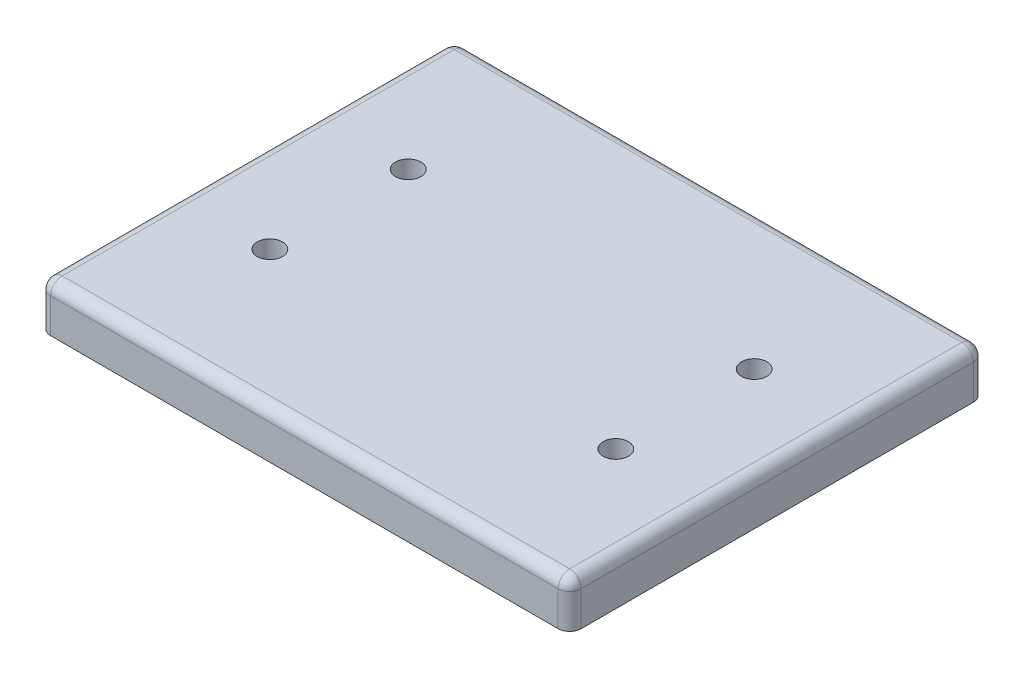
ISO-10303-21;
HEADER;
FILE_DESCRIPTION(('STEP AP214'),'2;1');
FILE_NAME('part.step','',(''),(''),'','','');
FILE_SCHEMA(('AUTOMOTIVE_DESIGN { 1 0 10303 214 1 1 1 1 }'));
ENDSEC;
DATA;
#1=APPLICATION_CONTEXT('core data for automotive mechanical design processes');
#2=APPLICATION_PROTOCOL_DEFINITION('international standard','automotive_design',2000,#1);
#3=PRODUCT_CONTEXT('',#1,'mechanical');
#4=PRODUCT('Part','Part','',(#3));
#5=PRODUCT_RELATED_PRODUCT_CATEGORY('part','',(#4));
#6=PRODUCT_DEFINITION_FORMATION('','',#4);
#7=PRODUCT_DEFINITION_CONTEXT('part definition',#1,'design');
#8=PRODUCT_DEFINITION('design','',#6,#7);
#9=PRODUCT_DEFINITION_SHAPE('','',#8);
#10=(LENGTH_UNIT() NAMED_UNIT(*) SI_UNIT(.MILLI.,.METRE.));
#11=(NAMED_UNIT(*) PLANE_ANGLE_UNIT() SI_UNIT($,.RADIAN.));
#12=(NAMED_UNIT(*) SI_UNIT($,.STERADIAN.) SOLID_ANGLE_UNIT());
#13=UNCERTAINTY_MEASURE_WITH_UNIT(LENGTH_MEASURE(1.E-05),#10,'distance_accuracy_value','');
#14=(GEOMETRIC_REPRESENTATION_CONTEXT(3) GLOBAL_UNCERTAINTY_ASSIGNED_CONTEXT((#13)) GLOBAL_UNIT_ASSIGNED_CONTEXT((#10,
#11,#12)) REPRESENTATION_CONTEXT('',''));
#15=CARTESIAN_POINT('',(0.,0.,0.));
#16=DIRECTION('',(0.,0.,1.));
#17=DIRECTION('',(1.,0.,0.));
#18=AXIS2_PLACEMENT_3D('',#15,#16,#17);
#19=CARTESIAN_POINT('',(115.,20.,-90.));
#20=DIRECTION('',(-1.,0.,0.));
#21=DIRECTION('',(0.,0.,1.));
#22=AXIS2_PLACEMENT_3D('',#19,#20,#21);
#23=PLANE('',#22);
#24=DIRECTION('',(0.,0.,-1.));
#25=VECTOR('',#24,1.);
#26=CARTESIAN_POINT('',(115.,0.,-90.));
#27=LINE('',#26,#25);
#28=CARTESIAN_POINT('',(115.,0.,84.9999999999999));
#29=VERTEX_POINT('',#28);
#30=CARTESIAN_POINT('',(115.,0.,-85.));
#31=VERTEX_POINT('',#30);
#32=EDGE_CURVE('E238',#29,#31,#27,.T.);
#33=ORIENTED_EDGE('',*,*,#32,.T.);
#34=DIRECTION('',(0.,-1.,0.));
#35=VECTOR('',#34,1.);
#36=CARTESIAN_POINT('',(115.,20.,-85.));
#37=LINE('',#36,#35);
#38=CARTESIAN_POINT('',(115.,15.,-85.));
#39=VERTEX_POINT('',#38);
#40=EDGE_CURVE('E209',#31,#39,#37,.F.);
#41=ORIENTED_EDGE('',*,*,#40,.T.);
#42=DIRECTION('',(0.,0.,-1.));
#43=VECTOR('',#42,1.);
#44=CARTESIAN_POINT('',(115.,15.,90.));
#45=LINE('',#44,#43);
#46=CARTESIAN_POINT('',(115.,15.,85.));
#47=VERTEX_POINT('',#46);
#48=EDGE_CURVE('E125',#39,#47,#45,.F.);
#49=ORIENTED_EDGE('',*,*,#48,.T.);
#50=DIRECTION('',(0.,-1.,0.));
#51=VECTOR('',#50,1.);
#52=CARTESIAN_POINT('',(115.,20.,85.));
#53=LINE('',#52,#51);
#54=EDGE_CURVE('E207',#47,#29,#53,.T.);
#55=ORIENTED_EDGE('',*,*,#54,.T.);
#56=EDGE_LOOP('',(#33,#41,#49,#55));
#57=FACE_BOUND('',#56,.T.);
#58=ADVANCED_FACE('F35',(#57),#23,.F.);
#59=CARTESIAN_POINT('',(-115.,20.,-90.));
#60=DIRECTION('',(0.,0.,1.));
#61=DIRECTION('',(1.,0.,0.));
#62=AXIS2_PLACEMENT_3D('',#59,#60,#61);
#63=PLANE('',#62);
#64=DIRECTION('',(-1.,0.,0.));
#65=VECTOR('',#64,1.);
#66=CARTESIAN_POINT('',(115.,15.,-90.));
#67=LINE('',#66,#65);
#68=CARTESIAN_POINT('',(-110.,15.,-90.));
#69=VERTEX_POINT('',#68);
#70=CARTESIAN_POINT('',(110.,15.,-90.));
#71=VERTEX_POINT('',#70);
#72=EDGE_CURVE('E162',#69,#71,#67,.F.);
#73=ORIENTED_EDGE('',*,*,#72,.T.);
#74=DIRECTION('',(0.,-1.,0.));
#75=VECTOR('',#74,1.);
#76=CARTESIAN_POINT('',(110.,20.,-90.));
#77=LINE('',#76,#75);
#78=CARTESIAN_POINT('',(110.,0.,-90.));
#79=VERTEX_POINT('',#78);
#80=EDGE_CURVE('E198',#71,#79,#77,.T.);
#81=ORIENTED_EDGE('',*,*,#80,.T.);
#82=DIRECTION('',(-1.,0.,0.));
#83=VECTOR('',#82,1.);
#84=CARTESIAN_POINT('',(-115.,0.,-90.));
#85=LINE('',#84,#83);
#86=CARTESIAN_POINT('',(-110.,0.,-90.));
#87=VERTEX_POINT('',#86);
#88=EDGE_CURVE('E243',#79,#87,#85,.T.);
#89=ORIENTED_EDGE('',*,*,#88,.T.);
#90=DIRECTION('',(0.,-1.,0.));
#91=VECTOR('',#90,1.);
#92=CARTESIAN_POINT('',(-110.,20.,-90.));
#93=LINE('',#92,#91);
#94=EDGE_CURVE('E196',#87,#69,#93,.F.);
#95=ORIENTED_EDGE('',*,*,#94,.T.);
#96=EDGE_LOOP('',(#73,#81,#89,#95));
#97=FACE_BOUND('',#96,.T.);
#98=ADVANCED_FACE('F268',(#97),#63,.F.);
#99=CARTESIAN_POINT('',(-115.,20.,-90.));
#100=DIRECTION('',(1.,0.,0.));
#101=DIRECTION('',(0.,0.,-1.));
#102=AXIS2_PLACEMENT_3D('',#99,#100,#101);
#103=PLANE('',#102);
#104=DIRECTION('',(0.,0.,1.));
#105=VECTOR('',#104,1.);
#106=CARTESIAN_POINT('',(-115.,15.,-90.));
#107=LINE('',#106,#105);
#108=CARTESIAN_POINT('',(-115.,15.,85.));
#109=VERTEX_POINT('',#108);
#110=CARTESIAN_POINT('',(-115.,15.,-85.));
#111=VERTEX_POINT('',#110);
#112=EDGE_CURVE('E156',#109,#111,#107,.F.);
#113=ORIENTED_EDGE('',*,*,#112,.T.);
#114=DIRECTION('',(0.,-1.,0.));
#115=VECTOR('',#114,1.);
#116=CARTESIAN_POINT('',(-115.,20.,-85.));
#117=LINE('',#116,#115);
#118=CARTESIAN_POINT('',(-115.,0.,-85.));
#119=VERTEX_POINT('',#118);
#120=EDGE_CURVE('E59',#111,#119,#117,.T.);
#121=ORIENTED_EDGE('',*,*,#120,.T.);
#122=DIRECTION('',(0.,0.,1.));
#123=VECTOR('',#122,1.);
#124=CARTESIAN_POINT('',(-115.,0.,-90.));
#125=LINE('',#124,#123);
#126=CARTESIAN_POINT('',(-115.,0.,84.9999999999999));
#127=VERTEX_POINT('',#126);
#128=EDGE_CURVE('E247',#119,#127,#125,.T.);
#129=ORIENTED_EDGE('',*,*,#128,.T.);
#130=DIRECTION('',(0.,-1.,0.));
#131=VECTOR('',#130,1.);
#132=CARTESIAN_POINT('',(-115.,20.,85.));
#133=LINE('',#132,#131);
#134=EDGE_CURVE('E211',#127,#109,#133,.F.);
#135=ORIENTED_EDGE('',*,*,#134,.T.);
#136=EDGE_LOOP('',(#113,#121,#129,#135));
#137=FACE_BOUND('',#136,.T.);
#138=ADVANCED_FACE('F292',(#137),#103,.F.);
#139=CARTESIAN_POINT('',(-115.,20.,90.));
#140=DIRECTION('',(0.,0.,-1.));
#141=DIRECTION('',(-1.,0.,0.));
#142=AXIS2_PLACEMENT_3D('',#139,#140,#141);
#143=PLANE('',#142);
#144=DIRECTION('',(1.,0.,0.));
#145=VECTOR('',#144,1.);
#146=CARTESIAN_POINT('',(-115.,15.,90.));
#147=LINE('',#146,#145);
#148=CARTESIAN_POINT('',(110.,15.,90.));
#149=VERTEX_POINT('',#148);
#150=CARTESIAN_POINT('',(-110.,15.,90.));
#151=VERTEX_POINT('',#150);
#152=EDGE_CURVE('E136',#149,#151,#147,.F.);
#153=ORIENTED_EDGE('',*,*,#152,.T.);
#154=DIRECTION('',(0.,-1.,0.));
#155=VECTOR('',#154,1.);
#156=CARTESIAN_POINT('',(-110.,20.,90.));
#157=LINE('',#156,#155);
#158=CARTESIAN_POINT('',(-110.,0.,90.));
#159=VERTEX_POINT('',#158);
#160=EDGE_CURVE('E11',#151,#159,#157,.T.);
#161=ORIENTED_EDGE('',*,*,#160,.T.);
#162=DIRECTION('',(1.,0.,0.));
#163=VECTOR('',#162,1.);
#164=CARTESIAN_POINT('',(-115.,0.,90.));
#165=LINE('',#164,#163);
#166=CARTESIAN_POINT('',(110.,0.,90.));
#167=VERTEX_POINT('',#166);
#168=EDGE_CURVE('E149',#159,#167,#165,.T.);
#169=ORIENTED_EDGE('',*,*,#168,.T.);
#170=DIRECTION('',(0.,-1.,0.));
#171=VECTOR('',#170,1.);
#172=CARTESIAN_POINT('',(110.,20.,90.));
#173=LINE('',#172,#171);
#174=EDGE_CURVE('E44',#167,#149,#173,.F.);
#175=ORIENTED_EDGE('',*,*,#174,.T.);
#176=EDGE_LOOP('',(#153,#161,#169,#175));
#177=FACE_BOUND('',#176,.T.);
#178=ADVANCED_FACE('F230',(#177),#143,.F.);
#179=CARTESIAN_POINT('',(0.,20.,0.));
#180=DIRECTION('',(0.,1.,0.));
#181=DIRECTION('',(0.,0.,1.));
#182=AXIS2_PLACEMENT_3D('',#179,#180,#181);
#183=PLANE('',#182);
#184=CARTESIAN_POINT('',(-75.,20.,-30.));
#185=DIRECTION('',(0.,1.,0.));
#186=DIRECTION('',(0.,0.,1.));
#187=AXIS2_PLACEMENT_3D('',#184,#185,#186);
#188=CIRCLE('',#187,5.5);
#189=CARTESIAN_POINT('',(-75.,20.,-24.5));
#190=VERTEX_POINT('',#189);
#191=EDGE_CURVE('E184',#190,#190,#188,.T.);
#192=ORIENTED_EDGE('',*,*,#191,.F.);
#193=EDGE_LOOP('',(#192));
#194=FACE_BOUND('',#193,.T.);
#195=CARTESIAN_POINT('',(75.,20.,-30.));
#196=DIRECTION('',(0.,-1.,0.));
#197=DIRECTION('',(0.,0.,1.));
#198=AXIS2_PLACEMENT_3D('',#195,#196,#197);
#199=CIRCLE('',#198,5.5);
#200=CARTESIAN_POINT('',(75.,20.,-24.5));
#201=VERTEX_POINT('',#200);
#202=EDGE_CURVE('E180',#201,#201,#199,.T.);
#203=ORIENTED_EDGE('',*,*,#202,.T.);
#204=EDGE_LOOP('',(#203));
#205=FACE_BOUND('',#204,.T.);
#206=CARTESIAN_POINT('',(75.,20.,30.));
#207=DIRECTION('',(0.,1.,0.));
#208=DIRECTION('',(0.,0.,-1.));
#209=AXIS2_PLACEMENT_3D('',#206,#207,#208);
#210=CIRCLE('',#209,5.5);
#211=CARTESIAN_POINT('',(75.,20.,24.5));
#212=VERTEX_POINT('',#211);
#213=EDGE_CURVE('E175',#212,#212,#210,.T.);
#214=ORIENTED_EDGE('',*,*,#213,.F.);
#215=EDGE_LOOP('',(#214));
#216=FACE_BOUND('',#215,.T.);
#217=CARTESIAN_POINT('',(-75.,20.,30.));
#218=DIRECTION('',(0.,-1.,0.));
#219=DIRECTION('',(0.,0.,-1.));
#220=AXIS2_PLACEMENT_3D('',#217,#218,#219);
#221=CIRCLE('',#220,5.5);
#222=CARTESIAN_POINT('',(-75.,20.,24.5));
#223=VERTEX_POINT('',#222);
#224=EDGE_CURVE('E170',#223,#223,#221,.T.);
#225=ORIENTED_EDGE('',*,*,#224,.T.);
#226=EDGE_LOOP('',(#225));
#227=FACE_BOUND('',#226,.T.);
#228=DIRECTION('',(0.,0.,1.));
#229=VECTOR('',#228,1.);
#230=CARTESIAN_POINT('',(-110.,20.,90.));
#231=LINE('',#230,#229);
#232=CARTESIAN_POINT('',(-110.,20.,-85.));
#233=VERTEX_POINT('',#232);
#234=CARTESIAN_POINT('',(-110.,20.,85.));
#235=VERTEX_POINT('',#234);
#236=EDGE_CURVE('E154',#233,#235,#231,.T.);
#237=ORIENTED_EDGE('',*,*,#236,.T.);
#238=DIRECTION('',(1.,0.,0.));
#239=VECTOR('',#238,1.);
#240=CARTESIAN_POINT('',(115.,20.,85.));
#241=LINE('',#240,#239);
#242=CARTESIAN_POINT('',(110.,20.,85.));
#243=VERTEX_POINT('',#242);
#244=EDGE_CURVE('E133',#235,#243,#241,.T.);
#245=ORIENTED_EDGE('',*,*,#244,.T.);
#246=DIRECTION('',(0.,0.,-1.));
#247=VECTOR('',#246,1.);
#248=CARTESIAN_POINT('',(110.,20.,-90.));
#249=LINE('',#248,#247);
#250=CARTESIAN_POINT('',(110.,20.,-85.));
#251=VERTEX_POINT('',#250);
#252=EDGE_CURVE('E142',#243,#251,#249,.T.);
#253=ORIENTED_EDGE('',*,*,#252,.T.);
#254=DIRECTION('',(-1.,0.,0.));
#255=VECTOR('',#254,1.);
#256=CARTESIAN_POINT('',(-115.,20.,-85.));
#257=LINE('',#256,#255);
#258=EDGE_CURVE('E148',#251,#233,#257,.T.);
#259=ORIENTED_EDGE('',*,*,#258,.T.);
#260=EDGE_LOOP('',(#237,#245,#253,#259));
#261=FACE_BOUND('',#260,.T.);
#262=ADVANCED_FACE('F152',(#194,#205,#216,#227,#261),#183,.T.);
#263=CARTESIAN_POINT('',(0.,0.,0.));
#264=DIRECTION('',(0.,1.,0.));
#265=DIRECTION('',(0.,0.,1.));
#266=AXIS2_PLACEMENT_3D('',#263,#264,#265);
#267=PLANE('',#266);
#268=CARTESIAN_POINT('',(-75.,0.,-30.));
#269=DIRECTION('',(0.,1.,0.));
#270=DIRECTION('',(0.,0.,1.));
#271=AXIS2_PLACEMENT_3D('',#268,#269,#270);
#272=CIRCLE('',#271,9.00000000000001);
#273=CARTESIAN_POINT('',(-75.,0.,-21.));
#274=VERTEX_POINT('',#273);
#275=EDGE_CURVE('E183',#274,#274,#272,.T.);
#276=ORIENTED_EDGE('',*,*,#275,.T.);
#277=EDGE_LOOP('',(#276));
#278=FACE_BOUND('',#277,.T.);
#279=CARTESIAN_POINT('',(75.,0.,-30.));
#280=DIRECTION('',(0.,-1.,0.));
#281=DIRECTION('',(0.,0.,1.));
#282=AXIS2_PLACEMENT_3D('',#279,#280,#281);
#283=CIRCLE('',#282,9.00000000000001);
#284=CARTESIAN_POINT('',(75.,0.,-21.));
#285=VERTEX_POINT('',#284);
#286=EDGE_CURVE('E179',#285,#285,#283,.T.);
#287=ORIENTED_EDGE('',*,*,#286,.F.);
#288=EDGE_LOOP('',(#287));
#289=FACE_BOUND('',#288,.T.);
#290=CARTESIAN_POINT('',(75.,0.,30.));
#291=DIRECTION('',(0.,1.,0.));
#292=DIRECTION('',(0.,0.,-1.));
#293=AXIS2_PLACEMENT_3D('',#290,#291,#292);
#294=CIRCLE('',#293,9.00000000000001);
#295=CARTESIAN_POINT('',(75.,0.,21.));
#296=VERTEX_POINT('',#295);
#297=EDGE_CURVE('E174',#296,#296,#294,.T.);
#298=ORIENTED_EDGE('',*,*,#297,.T.);
#299=EDGE_LOOP('',(#298));
#300=FACE_BOUND('',#299,.T.);
#301=CARTESIAN_POINT('',(-75.,0.,30.));
#302=DIRECTION('',(0.,-1.,0.));
#303=DIRECTION('',(0.,0.,-1.));
#304=AXIS2_PLACEMENT_3D('',#301,#302,#303);
#305=CIRCLE('',#304,9.00000000000001);
#306=CARTESIAN_POINT('',(-75.,0.,21.));
#307=VERTEX_POINT('',#306);
#308=EDGE_CURVE('E169',#307,#307,#305,.T.);
#309=ORIENTED_EDGE('',*,*,#308,.F.);
#310=EDGE_LOOP('',(#309));
#311=FACE_BOUND('',#310,.T.);
#312=ORIENTED_EDGE('',*,*,#88,.F.);
#313=CARTESIAN_POINT('',(110.,0.,-85.));
#314=DIRECTION('',(0.,1.,0.));
#315=DIRECTION('',(0.,0.,1.));
#316=AXIS2_PLACEMENT_3D('',#313,#314,#315);
#317=CIRCLE('',#316,5.);
#318=EDGE_CURVE('E205',#79,#31,#317,.F.);
#319=ORIENTED_EDGE('',*,*,#318,.T.);
#320=ORIENTED_EDGE('',*,*,#32,.F.);
#321=CARTESIAN_POINT('',(110.,0.,85.));
#322=DIRECTION('',(0.,1.,0.));
#323=DIRECTION('',(0.,0.,1.));
#324=AXIS2_PLACEMENT_3D('',#321,#322,#323);
#325=CIRCLE('',#324,5.);
#326=EDGE_CURVE('E200',#29,#167,#325,.F.);
#327=ORIENTED_EDGE('',*,*,#326,.T.);
#328=ORIENTED_EDGE('',*,*,#168,.F.);
#329=CARTESIAN_POINT('',(-110.,0.,85.));
#330=DIRECTION('',(0.,1.,0.));
#331=DIRECTION('',(0.,0.,1.));
#332=AXIS2_PLACEMENT_3D('',#329,#330,#331);
#333=CIRCLE('',#332,5.);
#334=EDGE_CURVE('E52',#159,#127,#333,.F.);
#335=ORIENTED_EDGE('',*,*,#334,.T.);
#336=ORIENTED_EDGE('',*,*,#128,.F.);
#337=CARTESIAN_POINT('',(-110.,0.,-85.));
#338=DIRECTION('',(0.,1.,0.));
#339=DIRECTION('',(0.,0.,1.));
#340=AXIS2_PLACEMENT_3D('',#337,#338,#339);
#341=CIRCLE('',#340,5.);
#342=EDGE_CURVE('E203',#119,#87,#341,.F.);
#343=ORIENTED_EDGE('',*,*,#342,.T.);
#344=EDGE_LOOP('',(#312,#319,#320,#327,#328,#335,#336,#343));
#345=FACE_BOUND('',#344,.T.);
#346=ADVANCED_FACE('F241',(#278,#289,#300,#311,#345),#267,.F.);
#347=CARTESIAN_POINT('',(0.,15.,-85.));
#348=DIRECTION('',(1.,0.,0.));
#349=DIRECTION('',(0.,0.,-1.));
#350=AXIS2_PLACEMENT_3D('',#347,#348,#349);
#351=CYLINDRICAL_SURFACE('',#350,5.);
#352=ORIENTED_EDGE('',*,*,#258,.F.);
#353=CARTESIAN_POINT('',(110.,15.,-85.));
#354=DIRECTION('',(1.,0.,0.));
#355=DIRECTION('',(0.,0.,-1.));
#356=AXIS2_PLACEMENT_3D('',#353,#354,#355);
#357=CIRCLE('',#356,5.);
#358=EDGE_CURVE('E189',#251,#71,#357,.F.);
#359=ORIENTED_EDGE('',*,*,#358,.T.);
#360=ORIENTED_EDGE('',*,*,#72,.F.);
#361=CARTESIAN_POINT('',(-110.,15.,-85.));
#362=DIRECTION('',(1.,0.,0.));
#363=DIRECTION('',(0.,0.,-1.));
#364=AXIS2_PLACEMENT_3D('',#361,#362,#363);
#365=CIRCLE('',#364,5.);
#366=EDGE_CURVE('E187',#69,#233,#365,.T.);
#367=ORIENTED_EDGE('',*,*,#366,.T.);
#368=EDGE_LOOP('',(#352,#359,#360,#367));
#369=FACE_BOUND('',#368,.T.);
#370=ADVANCED_FACE('F276',(#369),#351,.T.);
#371=CARTESIAN_POINT('',(-110.,15.,0.));
#372=DIRECTION('',(0.,0.,-1.));
#373=DIRECTION('',(-1.,0.,0.));
#374=AXIS2_PLACEMENT_3D('',#371,#372,#373);
#375=CYLINDRICAL_SURFACE('',#374,5.);
#376=ORIENTED_EDGE('',*,*,#236,.F.);
#377=CARTESIAN_POINT('',(-110.,15.,-85.));
#378=DIRECTION('',(0.,0.,-1.));
#379=DIRECTION('',(-1.,0.,0.));
#380=AXIS2_PLACEMENT_3D('',#377,#378,#379);
#381=CIRCLE('',#380,5.);
#382=EDGE_CURVE('E138',#233,#111,#381,.F.);
#383=ORIENTED_EDGE('',*,*,#382,.T.);
#384=ORIENTED_EDGE('',*,*,#112,.F.);
#385=CARTESIAN_POINT('',(-110.,15.,85.));
#386=DIRECTION('',(0.,0.,-1.));
#387=DIRECTION('',(-1.,0.,0.));
#388=AXIS2_PLACEMENT_3D('',#385,#386,#387);
#389=CIRCLE('',#388,5.);
#390=EDGE_CURVE('E191',#109,#235,#389,.T.);
#391=ORIENTED_EDGE('',*,*,#390,.T.);
#392=EDGE_LOOP('',(#376,#383,#384,#391));
#393=FACE_BOUND('',#392,.T.);
#394=ADVANCED_FACE('F257',(#393),#375,.T.);
#395=CARTESIAN_POINT('',(110.,15.,0.));
#396=DIRECTION('',(0.,0.,1.));
#397=DIRECTION('',(1.,0.,0.));
#398=AXIS2_PLACEMENT_3D('',#395,#396,#397);
#399=CYLINDRICAL_SURFACE('',#398,5.);
#400=ORIENTED_EDGE('',*,*,#48,.F.);
#401=CARTESIAN_POINT('',(110.,15.,-85.));
#402=DIRECTION('',(0.,0.,1.));
#403=DIRECTION('',(1.,0.,0.));
#404=AXIS2_PLACEMENT_3D('',#401,#402,#403);
#405=CIRCLE('',#404,5.);
#406=EDGE_CURVE('E124',#39,#251,#405,.T.);
#407=ORIENTED_EDGE('',*,*,#406,.T.);
#408=ORIENTED_EDGE('',*,*,#252,.F.);
#409=CARTESIAN_POINT('',(110.,15.,85.));
#410=DIRECTION('',(0.,0.,1.));
#411=DIRECTION('',(1.,0.,0.));
#412=AXIS2_PLACEMENT_3D('',#409,#410,#411);
#413=CIRCLE('',#412,5.);
#414=EDGE_CURVE('E115',#243,#47,#413,.F.);
#415=ORIENTED_EDGE('',*,*,#414,.T.);
#416=EDGE_LOOP('',(#400,#407,#408,#415));
#417=FACE_BOUND('',#416,.T.);
#418=ADVANCED_FACE('F143',(#417),#399,.T.);
#419=CARTESIAN_POINT('',(0.,15.,85.));
#420=DIRECTION('',(-1.,0.,0.));
#421=DIRECTION('',(0.,0.,1.));
#422=AXIS2_PLACEMENT_3D('',#419,#420,#421);
#423=CYLINDRICAL_SURFACE('',#422,5.);
#424=ORIENTED_EDGE('',*,*,#244,.F.);
#425=CARTESIAN_POINT('',(-110.,15.,85.));
#426=DIRECTION('',(-1.,0.,0.));
#427=DIRECTION('',(0.,0.,1.));
#428=AXIS2_PLACEMENT_3D('',#425,#426,#427);
#429=CIRCLE('',#428,5.);
#430=EDGE_CURVE('E137',#235,#151,#429,.F.);
#431=ORIENTED_EDGE('',*,*,#430,.T.);
#432=ORIENTED_EDGE('',*,*,#152,.F.);
#433=CARTESIAN_POINT('',(110.,15.,85.));
#434=DIRECTION('',(-1.,0.,0.));
#435=DIRECTION('',(0.,0.,1.));
#436=AXIS2_PLACEMENT_3D('',#433,#434,#435);
#437=CIRCLE('',#436,5.);
#438=EDGE_CURVE('E118',#149,#243,#437,.T.);
#439=ORIENTED_EDGE('',*,*,#438,.T.);
#440=EDGE_LOOP('',(#424,#431,#432,#439));
#441=FACE_BOUND('',#440,.T.);
#442=ADVANCED_FACE('F130',(#441),#423,.T.);
#443=CARTESIAN_POINT('',(-75.,10.,30.));
#444=DIRECTION('',(0.,-1.,0.));
#445=DIRECTION('',(0.,0.,-1.));
#446=AXIS2_PLACEMENT_3D('',#443,#444,#445);
#447=CYLINDRICAL_SURFACE('',#446,9.00000000000001);
#448=CARTESIAN_POINT('',(-75.,10.,30.));
#449=DIRECTION('',(0.,-1.,0.));
#450=DIRECTION('',(0.,0.,-1.));
#451=AXIS2_PLACEMENT_3D('',#448,#449,#450);
#452=CIRCLE('',#451,9.00000000000001);
#453=CARTESIAN_POINT('',(-75.,10.,21.));
#454=VERTEX_POINT('',#453);
#455=EDGE_CURVE('E244',#454,#454,#452,.T.);
#456=ORIENTED_EDGE('',*,*,#455,.F.);
#457=EDGE_LOOP('',(#456));
#458=FACE_BOUND('',#457,.T.);
#459=ORIENTED_EDGE('',*,*,#308,.T.);
#460=EDGE_LOOP('',(#459));
#461=FACE_BOUND('',#460,.T.);
#462=ADVANCED_FACE('F298',(#458,#461),#447,.F.);
#463=CARTESIAN_POINT('',(-75.,10.,30.));
#464=DIRECTION('',(0.,-1.,0.));
#465=DIRECTION('',(0.,0.,-1.));
#466=AXIS2_PLACEMENT_3D('',#463,#464,#465);
#467=PLANE('',#466);
#468=CARTESIAN_POINT('',(-75.,10.,30.));
#469=DIRECTION('',(0.,-1.,0.));
#470=DIRECTION('',(0.,0.,-1.));
#471=AXIS2_PLACEMENT_3D('',#468,#469,#470);
#472=CIRCLE('',#471,5.5);
#473=CARTESIAN_POINT('',(-75.,10.,24.5));
#474=VERTEX_POINT('',#473);
#475=EDGE_CURVE('E166',#474,#474,#472,.T.);
#476=ORIENTED_EDGE('',*,*,#475,.F.);
#477=EDGE_LOOP('',(#476));
#478=FACE_BOUND('',#477,.T.);
#479=ORIENTED_EDGE('',*,*,#455,.T.);
#480=EDGE_LOOP('',(#479));
#481=FACE_BOUND('',#480,.T.);
#482=ADVANCED_FACE('F315',(#478,#481),#467,.T.);
#483=CARTESIAN_POINT('',(-75.,20.,30.));
#484=DIRECTION('',(0.,-1.,0.));
#485=DIRECTION('',(0.,0.,-1.));
#486=AXIS2_PLACEMENT_3D('',#483,#484,#485);
#487=CYLINDRICAL_SURFACE('',#486,5.5);
#488=ORIENTED_EDGE('',*,*,#475,.T.);
#489=EDGE_LOOP('',(#488));
#490=FACE_BOUND('',#489,.T.);
#491=ORIENTED_EDGE('',*,*,#224,.F.);
#492=EDGE_LOOP('',(#491));
#493=FACE_BOUND('',#492,.T.);
#494=ADVANCED_FACE('F323',(#490,#493),#487,.F.);
#495=CARTESIAN_POINT('',(75.,10.,30.));
#496=DIRECTION('',(0.,-1.,0.));
#497=DIRECTION('',(0.,0.,-1.));
#498=AXIS2_PLACEMENT_3D('',#495,#496,#497);
#499=CYLINDRICAL_SURFACE('',#498,9.00000000000001);
#500=CARTESIAN_POINT('',(75.,10.,30.));
#501=DIRECTION('',(0.,1.,0.));
#502=DIRECTION('',(0.,0.,-1.));
#503=AXIS2_PLACEMENT_3D('',#500,#501,#502);
#504=CIRCLE('',#503,9.00000000000001);
#505=CARTESIAN_POINT('',(75.,10.,21.));
#506=VERTEX_POINT('',#505);
#507=EDGE_CURVE('E562',#506,#506,#504,.T.);
#508=ORIENTED_EDGE('',*,*,#507,.T.);
#509=EDGE_LOOP('',(#508));
#510=FACE_BOUND('',#509,.T.);
#511=ORIENTED_EDGE('',*,*,#297,.F.);
#512=EDGE_LOOP('',(#511));
#513=FACE_BOUND('',#512,.T.);
#514=ADVANCED_FACE('F331',(#510,#513),#499,.F.);
#515=CARTESIAN_POINT('',(75.,10.,30.));
#516=DIRECTION('',(0.,-1.,0.));
#517=DIRECTION('',(0.,0.,-1.));
#518=AXIS2_PLACEMENT_3D('',#515,#516,#517);
#519=PLANE('',#518);
#520=CARTESIAN_POINT('',(75.,10.,30.));
#521=DIRECTION('',(0.,-1.,0.));
#522=DIRECTION('',(0.,0.,-1.));
#523=AXIS2_PLACEMENT_3D('',#520,#521,#522);
#524=CIRCLE('',#523,5.5);
#525=CARTESIAN_POINT('',(75.,10.,24.5));
#526=VERTEX_POINT('',#525);
#527=EDGE_CURVE('E171',#526,#526,#524,.F.);
#528=ORIENTED_EDGE('',*,*,#527,.T.);
#529=EDGE_LOOP('',(#528));
#530=FACE_BOUND('',#529,.T.);
#531=ORIENTED_EDGE('',*,*,#507,.F.);
#532=EDGE_LOOP('',(#531));
#533=FACE_BOUND('',#532,.T.);
#534=ADVANCED_FACE('F339',(#530,#533),#519,.T.);
#535=CARTESIAN_POINT('',(75.,20.,30.));
#536=DIRECTION('',(0.,-1.,0.));
#537=DIRECTION('',(0.,0.,-1.));
#538=AXIS2_PLACEMENT_3D('',#535,#536,#537);
#539=CYLINDRICAL_SURFACE('',#538,5.5);
#540=ORIENTED_EDGE('',*,*,#527,.F.);
#541=EDGE_LOOP('',(#540));
#542=FACE_BOUND('',#541,.T.);
#543=ORIENTED_EDGE('',*,*,#213,.T.);
#544=EDGE_LOOP('',(#543));
#545=FACE_BOUND('',#544,.T.);
#546=ADVANCED_FACE('F347',(#542,#545),#539,.F.);
#547=CARTESIAN_POINT('',(75.,10.,-30.));
#548=DIRECTION('',(0.,-1.,0.));
#549=DIRECTION('',(0.,0.,-1.));
#550=AXIS2_PLACEMENT_3D('',#547,#548,#549);
#551=CYLINDRICAL_SURFACE('',#550,9.00000000000001);
#552=CARTESIAN_POINT('',(75.,10.,-30.));
#553=DIRECTION('',(0.,-1.,0.));
#554=DIRECTION('',(0.,0.,1.));
#555=AXIS2_PLACEMENT_3D('',#552,#553,#554);
#556=CIRCLE('',#555,9.00000000000001);
#557=CARTESIAN_POINT('',(75.,10.,-21.));
#558=VERTEX_POINT('',#557);
#559=EDGE_CURVE('E570',#558,#558,#556,.T.);
#560=ORIENTED_EDGE('',*,*,#559,.F.);
#561=EDGE_LOOP('',(#560));
#562=FACE_BOUND('',#561,.T.);
#563=ORIENTED_EDGE('',*,*,#286,.T.);
#564=EDGE_LOOP('',(#563));
#565=FACE_BOUND('',#564,.T.);
#566=ADVANCED_FACE('F355',(#562,#565),#551,.F.);
#567=CARTESIAN_POINT('',(75.,10.,-30.));
#568=DIRECTION('',(0.,-1.,0.));
#569=DIRECTION('',(0.,0.,1.));
#570=AXIS2_PLACEMENT_3D('',#567,#568,#569);
#571=PLANE('',#570);
#572=CARTESIAN_POINT('',(75.,10.,-30.));
#573=DIRECTION('',(0.,-1.,0.));
#574=DIRECTION('',(0.,0.,-1.));
#575=AXIS2_PLACEMENT_3D('',#572,#573,#574);
#576=CIRCLE('',#575,5.5);
#577=CARTESIAN_POINT('',(75.,10.,-35.5));
#578=VERTEX_POINT('',#577);
#579=EDGE_CURVE('E176',#578,#578,#576,.T.);
#580=ORIENTED_EDGE('',*,*,#579,.F.);
#581=EDGE_LOOP('',(#580));
#582=FACE_BOUND('',#581,.T.);
#583=ORIENTED_EDGE('',*,*,#559,.T.);
#584=EDGE_LOOP('',(#583));
#585=FACE_BOUND('',#584,.T.);
#586=ADVANCED_FACE('F363',(#582,#585),#571,.T.);
#587=CARTESIAN_POINT('',(75.,20.,-30.));
#588=DIRECTION('',(0.,-1.,0.));
#589=DIRECTION('',(0.,0.,-1.));
#590=AXIS2_PLACEMENT_3D('',#587,#588,#589);
#591=CYLINDRICAL_SURFACE('',#590,5.5);
#592=ORIENTED_EDGE('',*,*,#579,.T.);
#593=EDGE_LOOP('',(#592));
#594=FACE_BOUND('',#593,.T.);
#595=ORIENTED_EDGE('',*,*,#202,.F.);
#596=EDGE_LOOP('',(#595));
#597=FACE_BOUND('',#596,.T.);
#598=ADVANCED_FACE('F371',(#594,#597),#591,.F.);
#599=CARTESIAN_POINT('',(-75.,10.,-30.));
#600=DIRECTION('',(0.,-1.,0.));
#601=DIRECTION('',(0.,0.,-1.));
#602=AXIS2_PLACEMENT_3D('',#599,#600,#601);
#603=CYLINDRICAL_SURFACE('',#602,9.00000000000001);
#604=CARTESIAN_POINT('',(-75.,10.,-30.));
#605=DIRECTION('',(0.,1.,0.));
#606=DIRECTION('',(0.,0.,1.));
#607=AXIS2_PLACEMENT_3D('',#604,#605,#606);
#608=CIRCLE('',#607,9.00000000000001);
#609=CARTESIAN_POINT('',(-75.,10.,-21.));
#610=VERTEX_POINT('',#609);
#611=EDGE_CURVE('E576',#610,#610,#608,.T.);
#612=ORIENTED_EDGE('',*,*,#611,.T.);
#613=EDGE_LOOP('',(#612));
#614=FACE_BOUND('',#613,.T.);
#615=ORIENTED_EDGE('',*,*,#275,.F.);
#616=EDGE_LOOP('',(#615));
#617=FACE_BOUND('',#616,.T.);
#618=ADVANCED_FACE('F379',(#614,#617),#603,.F.);
#619=CARTESIAN_POINT('',(-75.,10.,-30.));
#620=DIRECTION('',(0.,-1.,0.));
#621=DIRECTION('',(0.,0.,1.));
#622=AXIS2_PLACEMENT_3D('',#619,#620,#621);
#623=PLANE('',#622);
#624=CARTESIAN_POINT('',(-75.,10.,-30.));
#625=DIRECTION('',(0.,-1.,0.));
#626=DIRECTION('',(0.,0.,-1.));
#627=AXIS2_PLACEMENT_3D('',#624,#625,#626);
#628=CIRCLE('',#627,5.5);
#629=CARTESIAN_POINT('',(-75.,10.,-35.5));
#630=VERTEX_POINT('',#629);
#631=EDGE_CURVE('E181',#630,#630,#628,.F.);
#632=ORIENTED_EDGE('',*,*,#631,.T.);
#633=EDGE_LOOP('',(#632));
#634=FACE_BOUND('',#633,.T.);
#635=ORIENTED_EDGE('',*,*,#611,.F.);
#636=EDGE_LOOP('',(#635));
#637=FACE_BOUND('',#636,.T.);
#638=ADVANCED_FACE('F387',(#634,#637),#623,.T.);
#639=CARTESIAN_POINT('',(-75.,20.,-30.));
#640=DIRECTION('',(0.,-1.,0.));
#641=DIRECTION('',(0.,0.,-1.));
#642=AXIS2_PLACEMENT_3D('',#639,#640,#641);
#643=CYLINDRICAL_SURFACE('',#642,5.5);
#644=ORIENTED_EDGE('',*,*,#631,.F.);
#645=EDGE_LOOP('',(#644));
#646=FACE_BOUND('',#645,.T.);
#647=ORIENTED_EDGE('',*,*,#191,.T.);
#648=EDGE_LOOP('',(#647));
#649=FACE_BOUND('',#648,.T.);
#650=ADVANCED_FACE('F395',(#646,#649),#643,.F.);
#651=CARTESIAN_POINT('',(110.,20.,-85.));
#652=DIRECTION('',(0.,-1.,0.));
#653=DIRECTION('',(0.,0.,-1.));
#654=AXIS2_PLACEMENT_3D('',#651,#652,#653);
#655=CYLINDRICAL_SURFACE('',#654,5.);
#656=ORIENTED_EDGE('',*,*,#318,.F.);
#657=ORIENTED_EDGE('',*,*,#80,.F.);
#658=CARTESIAN_POINT('',(110.,15.,-85.));
#659=DIRECTION('',(0.,1.,0.));
#660=DIRECTION('',(0.,0.,1.));
#661=AXIS2_PLACEMENT_3D('',#658,#659,#660);
#662=CIRCLE('',#661,5.);
#663=EDGE_CURVE('E215',#39,#71,#662,.T.);
#664=ORIENTED_EDGE('',*,*,#663,.F.);
#665=ORIENTED_EDGE('',*,*,#40,.F.);
#666=EDGE_LOOP('',(#656,#657,#664,#665));
#667=FACE_BOUND('',#666,.T.);
#668=ADVANCED_FACE('F273',(#667),#655,.T.);
#669=CARTESIAN_POINT('',(110.,15.,-85.));
#670=DIRECTION('',(0.,0.,1.));
#671=DIRECTION('',(1.,0.,0.));
#672=AXIS2_PLACEMENT_3D('',#669,#670,#671);
#673=SPHERICAL_SURFACE('',#672,5.);
#674=ORIENTED_EDGE('',*,*,#663,.T.);
#675=ORIENTED_EDGE('',*,*,#358,.F.);
#676=ORIENTED_EDGE('',*,*,#406,.F.);
#677=EDGE_LOOP('',(#674,#675,#676));
#678=FACE_BOUND('',#677,.T.);
#679=ADVANCED_FACE('F275',(#678),#673,.T.);
#680=CARTESIAN_POINT('',(-110.,20.,-85.));
#681=DIRECTION('',(0.,-1.,0.));
#682=DIRECTION('',(0.,0.,-1.));
#683=AXIS2_PLACEMENT_3D('',#680,#681,#682);
#684=CYLINDRICAL_SURFACE('',#683,5.);
#685=ORIENTED_EDGE('',*,*,#342,.F.);
#686=ORIENTED_EDGE('',*,*,#120,.F.);
#687=CARTESIAN_POINT('',(-110.,15.,-85.));
#688=DIRECTION('',(0.,1.,0.));
#689=DIRECTION('',(0.,0.,1.));
#690=AXIS2_PLACEMENT_3D('',#687,#688,#689);
#691=CIRCLE('',#690,5.);
#692=EDGE_CURVE('E218',#69,#111,#691,.T.);
#693=ORIENTED_EDGE('',*,*,#692,.F.);
#694=ORIENTED_EDGE('',*,*,#94,.F.);
#695=EDGE_LOOP('',(#685,#686,#693,#694));
#696=FACE_BOUND('',#695,.T.);
#697=ADVANCED_FACE('F266',(#696),#684,.T.);
#698=CARTESIAN_POINT('',(-110.,15.,-85.));
#699=DIRECTION('',(0.,0.,1.));
#700=DIRECTION('',(1.,0.,0.));
#701=AXIS2_PLACEMENT_3D('',#698,#699,#700);
#702=SPHERICAL_SURFACE('',#701,5.);
#703=ORIENTED_EDGE('',*,*,#382,.F.);
#704=ORIENTED_EDGE('',*,*,#366,.F.);
#705=ORIENTED_EDGE('',*,*,#692,.T.);
#706=EDGE_LOOP('',(#703,#704,#705));
#707=FACE_BOUND('',#706,.T.);
#708=ADVANCED_FACE('F261',(#707),#702,.T.);
#709=CARTESIAN_POINT('',(-110.,20.,85.));
#710=DIRECTION('',(0.,-1.,0.));
#711=DIRECTION('',(0.,0.,-1.));
#712=AXIS2_PLACEMENT_3D('',#709,#710,#711);
#713=CYLINDRICAL_SURFACE('',#712,5.);
#714=ORIENTED_EDGE('',*,*,#334,.F.);
#715=ORIENTED_EDGE('',*,*,#160,.F.);
#716=CARTESIAN_POINT('',(-110.,15.,85.));
#717=DIRECTION('',(0.,1.,0.));
#718=DIRECTION('',(0.,0.,1.));
#719=AXIS2_PLACEMENT_3D('',#716,#717,#718);
#720=CIRCLE('',#719,5.);
#721=EDGE_CURVE('E219',#109,#151,#720,.T.);
#722=ORIENTED_EDGE('',*,*,#721,.F.);
#723=ORIENTED_EDGE('',*,*,#134,.F.);
#724=EDGE_LOOP('',(#714,#715,#722,#723));
#725=FACE_BOUND('',#724,.T.);
#726=ADVANCED_FACE('F227',(#725),#713,.T.);
#727=CARTESIAN_POINT('',(-110.,15.,85.));
#728=DIRECTION('',(0.,0.,1.));
#729=DIRECTION('',(1.,0.,0.));
#730=AXIS2_PLACEMENT_3D('',#727,#728,#729);
#731=SPHERICAL_SURFACE('',#730,5.);
#732=ORIENTED_EDGE('',*,*,#430,.F.);
#733=ORIENTED_EDGE('',*,*,#390,.F.);
#734=ORIENTED_EDGE('',*,*,#721,.T.);
#735=EDGE_LOOP('',(#732,#733,#734));
#736=FACE_BOUND('',#735,.T.);
#737=ADVANCED_FACE('F224',(#736),#731,.T.);
#738=CARTESIAN_POINT('',(110.,20.,85.));
#739=DIRECTION('',(0.,-1.,0.));
#740=DIRECTION('',(0.,0.,-1.));
#741=AXIS2_PLACEMENT_3D('',#738,#739,#740);
#742=CYLINDRICAL_SURFACE('',#741,5.);
#743=ORIENTED_EDGE('',*,*,#326,.F.);
#744=ORIENTED_EDGE('',*,*,#54,.F.);
#745=CARTESIAN_POINT('',(110.,15.,85.));
#746=DIRECTION('',(0.,1.,0.));
#747=DIRECTION('',(0.,0.,1.));
#748=AXIS2_PLACEMENT_3D('',#745,#746,#747);
#749=CIRCLE('',#748,5.);
#750=EDGE_CURVE('E39',#149,#47,#749,.T.);
#751=ORIENTED_EDGE('',*,*,#750,.F.);
#752=ORIENTED_EDGE('',*,*,#174,.F.);
#753=EDGE_LOOP('',(#743,#744,#751,#752));
#754=FACE_BOUND('',#753,.T.);
#755=ADVANCED_FACE('F37',(#754),#742,.T.);
#756=CARTESIAN_POINT('',(110.,15.,85.));
#757=DIRECTION('',(0.,0.,1.));
#758=DIRECTION('',(1.,0.,0.));
#759=AXIS2_PLACEMENT_3D('',#756,#757,#758);
#760=SPHERICAL_SURFACE('',#759,5.);
#761=ORIENTED_EDGE('',*,*,#750,.T.);
#762=ORIENTED_EDGE('',*,*,#414,.F.);
#763=ORIENTED_EDGE('',*,*,#438,.F.);
#764=EDGE_LOOP('',(#761,#762,#763));
#765=FACE_BOUND('',#764,.T.);
#766=ADVANCED_FACE('F117',(#765),#760,.T.);
#767=CLOSED_SHELL('',(#58,#98,#138,#178,#262,#346,#370,#394,#418,#442,#462,#482,#494,#514,#534,
#546,#566,#586,#598,#618,#638,#650,#668,#679,#697,#708,#726,#737,#755,#766));
#768=MANIFOLD_SOLID_BREP('B2',#767);
#769=ADVANCED_BREP_SHAPE_REPRESENTATION('',(#18,#768),#14);
#770=SHAPE_DEFINITION_REPRESENTATION(#9,#769);
ENDSEC;
END-ISO-10303-21;
